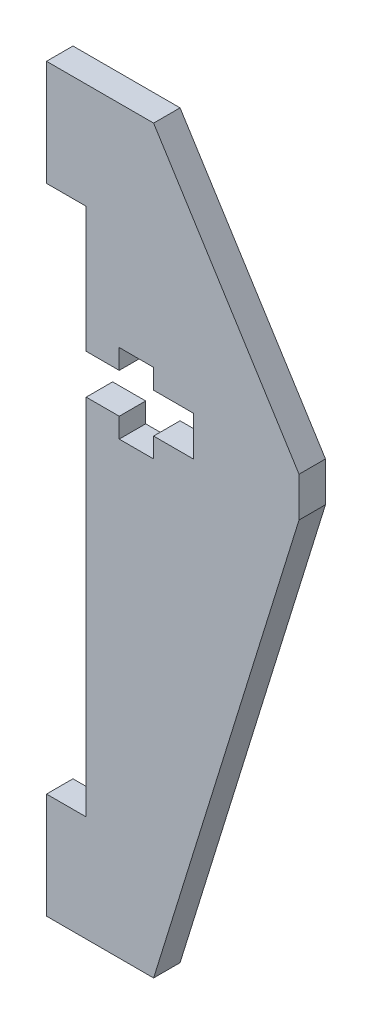
ISO-10303-21;
HEADER;
FILE_DESCRIPTION(('STEP AP214'),'2;1');
FILE_NAME('part.step','',(''),(''),'','','');
FILE_SCHEMA(('AUTOMOTIVE_DESIGN { 1 0 10303 214 1 1 1 1 }'));
ENDSEC;
DATA;
#1=APPLICATION_CONTEXT('core data for automotive mechanical design processes');
#2=APPLICATION_PROTOCOL_DEFINITION('international standard','automotive_design',2000,#1);
#3=PRODUCT_CONTEXT('',#1,'mechanical');
#4=PRODUCT('Part','Part','',(#3));
#5=PRODUCT_RELATED_PRODUCT_CATEGORY('part','',(#4));
#6=PRODUCT_DEFINITION_FORMATION('','',#4);
#7=PRODUCT_DEFINITION_CONTEXT('part definition',#1,'design');
#8=PRODUCT_DEFINITION('design','',#6,#7);
#9=PRODUCT_DEFINITION_SHAPE('','',#8);
#10=(LENGTH_UNIT() NAMED_UNIT(*) SI_UNIT(.MILLI.,.METRE.));
#11=(NAMED_UNIT(*) PLANE_ANGLE_UNIT() SI_UNIT($,.RADIAN.));
#12=(NAMED_UNIT(*) SI_UNIT($,.STERADIAN.) SOLID_ANGLE_UNIT());
#13=UNCERTAINTY_MEASURE_WITH_UNIT(LENGTH_MEASURE(1.E-05),#10,'distance_accuracy_value','');
#14=(GEOMETRIC_REPRESENTATION_CONTEXT(3) GLOBAL_UNCERTAINTY_ASSIGNED_CONTEXT((#13)) GLOBAL_UNIT_ASSIGNED_CONTEXT((#10,
#11,#12)) REPRESENTATION_CONTEXT('',''));
#15=CARTESIAN_POINT('',(0.,0.,0.));
#16=DIRECTION('',(0.,0.,1.));
#17=DIRECTION('',(1.,0.,0.));
#18=AXIS2_PLACEMENT_3D('',#15,#16,#17);
#19=CARTESIAN_POINT('',(0.,19.,2.));
#20=DIRECTION('',(0.,-1.,0.));
#21=DIRECTION('',(0.,0.,-1.));
#22=AXIS2_PLACEMENT_3D('',#19,#20,#21);
#23=PLANE('',#22);
#24=DIRECTION('',(-1.,0.,0.));
#25=VECTOR('',#24,1.);
#26=CARTESIAN_POINT('',(0.,19.,0.));
#27=LINE('',#26,#25);
#28=CARTESIAN_POINT('',(5.1000000000003,19.,0.));
#29=VERTEX_POINT('',#28);
#30=CARTESIAN_POINT('',(-3.,19.,0.));
#31=VERTEX_POINT('',#30);
#32=EDGE_CURVE('E127',#29,#31,#27,.T.);
#33=ORIENTED_EDGE('',*,*,#32,.T.);
#34=DIRECTION('',(0.,0.,-1.));
#35=VECTOR('',#34,1.);
#36=CARTESIAN_POINT('',(-3.,19.,2.));
#37=LINE('',#36,#35);
#38=CARTESIAN_POINT('',(-3.,19.,2.));
#39=VERTEX_POINT('',#38);
#40=EDGE_CURVE('E11',#39,#31,#37,.T.);
#41=ORIENTED_EDGE('',*,*,#40,.F.);
#42=DIRECTION('',(1.,0.,0.));
#43=VECTOR('',#42,1.);
#44=CARTESIAN_POINT('',(0.,19.,2.));
#45=LINE('',#44,#43);
#46=CARTESIAN_POINT('',(5.1000000000003,19.,2.));
#47=VERTEX_POINT('',#46);
#48=EDGE_CURVE('E51',#39,#47,#45,.T.);
#49=ORIENTED_EDGE('',*,*,#48,.T.);
#50=DIRECTION('',(0.,0.,-1.));
#51=VECTOR('',#50,1.);
#52=CARTESIAN_POINT('',(5.1000000000003,19.,2.));
#53=LINE('',#52,#51);
#54=EDGE_CURVE('E36',#47,#29,#53,.T.);
#55=ORIENTED_EDGE('',*,*,#54,.T.);
#56=EDGE_LOOP('',(#33,#41,#49,#55));
#57=FACE_BOUND('',#56,.T.);
#58=ADVANCED_FACE('F32',(#57),#23,.F.);
#59=CARTESIAN_POINT('',(-3.,19.,2.));
#60=DIRECTION('',(1.,0.,0.));
#61=DIRECTION('',(0.,1.,0.));
#62=AXIS2_PLACEMENT_3D('',#59,#60,#61);
#63=PLANE('',#62);
#64=DIRECTION('',(0.,-1.,0.));
#65=VECTOR('',#64,1.);
#66=CARTESIAN_POINT('',(-3.,19.,0.));
#67=LINE('',#66,#65);
#68=CARTESIAN_POINT('',(-3.,11.,0.));
#69=VERTEX_POINT('',#68);
#70=EDGE_CURVE('E121',#31,#69,#67,.T.);
#71=ORIENTED_EDGE('',*,*,#70,.T.);
#72=DIRECTION('',(0.,0.,-1.));
#73=VECTOR('',#72,1.);
#74=CARTESIAN_POINT('',(-3.,11.,2.));
#75=LINE('',#74,#73);
#76=CARTESIAN_POINT('',(-3.,11.,2.));
#77=VERTEX_POINT('',#76);
#78=EDGE_CURVE('E42',#77,#69,#75,.T.);
#79=ORIENTED_EDGE('',*,*,#78,.F.);
#80=DIRECTION('',(0.,-1.,0.));
#81=VECTOR('',#80,1.);
#82=CARTESIAN_POINT('',(-3.,19.,2.));
#83=LINE('',#82,#81);
#84=EDGE_CURVE('E196',#39,#77,#83,.T.);
#85=ORIENTED_EDGE('',*,*,#84,.F.);
#86=ORIENTED_EDGE('',*,*,#40,.T.);
#87=EDGE_LOOP('',(#71,#79,#85,#86));
#88=FACE_BOUND('',#87,.T.);
#89=ADVANCED_FACE('F439',(#88),#63,.F.);
#90=CARTESIAN_POINT('',(-3.,11.,2.));
#91=DIRECTION('',(0.,1.,0.));
#92=DIRECTION('',(0.,0.,1.));
#93=AXIS2_PLACEMENT_3D('',#90,#91,#92);
#94=PLANE('',#93);
#95=DIRECTION('',(1.,0.,0.));
#96=VECTOR('',#95,1.);
#97=CARTESIAN_POINT('',(-3.,11.,0.));
#98=LINE('',#97,#96);
#99=CARTESIAN_POINT('',(0.,11.,0.));
#100=VERTEX_POINT('',#99);
#101=EDGE_CURVE('E203',#69,#100,#98,.T.);
#102=ORIENTED_EDGE('',*,*,#101,.T.);
#103=DIRECTION('',(0.,0.,-1.));
#104=VECTOR('',#103,1.);
#105=CARTESIAN_POINT('',(0.,11.,2.));
#106=LINE('',#105,#104);
#107=CARTESIAN_POINT('',(0.,11.,2.));
#108=VERTEX_POINT('',#107);
#109=EDGE_CURVE('E200',#108,#100,#106,.T.);
#110=ORIENTED_EDGE('',*,*,#109,.F.);
#111=DIRECTION('',(1.,0.,0.));
#112=VECTOR('',#111,1.);
#113=CARTESIAN_POINT('',(-3.,11.,2.));
#114=LINE('',#113,#112);
#115=EDGE_CURVE('E189',#77,#108,#114,.T.);
#116=ORIENTED_EDGE('',*,*,#115,.F.);
#117=ORIENTED_EDGE('',*,*,#78,.T.);
#118=EDGE_LOOP('',(#102,#110,#116,#117));
#119=FACE_BOUND('',#118,.T.);
#120=ADVANCED_FACE('F201',(#119),#94,.F.);
#121=CARTESIAN_POINT('',(0.,11.,2.));
#122=DIRECTION('',(1.,0.,0.));
#123=DIRECTION('',(0.,1.,0.));
#124=AXIS2_PLACEMENT_3D('',#121,#122,#123);
#125=PLANE('',#124);
#126=DIRECTION('',(0.,-1.,0.));
#127=VECTOR('',#126,1.);
#128=CARTESIAN_POINT('',(0.,11.,0.));
#129=LINE('',#128,#127);
#130=CARTESIAN_POINT('',(0.,1.5,0.));
#131=VERTEX_POINT('',#130);
#132=EDGE_CURVE('E267',#100,#131,#129,.T.);
#133=ORIENTED_EDGE('',*,*,#132,.T.);
#134=DIRECTION('',(0.,0.,-1.));
#135=VECTOR('',#134,1.);
#136=CARTESIAN_POINT('',(0.,1.5,2.));
#137=LINE('',#136,#135);
#138=CARTESIAN_POINT('',(0.,1.5,2.));
#139=VERTEX_POINT('',#138);
#140=EDGE_CURVE('E206',#139,#131,#137,.T.);
#141=ORIENTED_EDGE('',*,*,#140,.F.);
#142=DIRECTION('',(0.,-1.,0.));
#143=VECTOR('',#142,1.);
#144=CARTESIAN_POINT('',(0.,11.,2.));
#145=LINE('',#144,#143);
#146=EDGE_CURVE('E193',#108,#139,#145,.T.);
#147=ORIENTED_EDGE('',*,*,#146,.F.);
#148=ORIENTED_EDGE('',*,*,#109,.T.);
#149=EDGE_LOOP('',(#133,#141,#147,#148));
#150=FACE_BOUND('',#149,.T.);
#151=ADVANCED_FACE('F208',(#150),#125,.F.);
#152=CARTESIAN_POINT('',(0.,1.5,2.));
#153=DIRECTION('',(0.,1.,0.));
#154=DIRECTION('',(0.,0.,1.));
#155=AXIS2_PLACEMENT_3D('',#152,#153,#154);
#156=PLANE('',#155);
#157=DIRECTION('',(1.,0.,0.));
#158=VECTOR('',#157,1.);
#159=CARTESIAN_POINT('',(0.,1.5,0.));
#160=LINE('',#159,#158);
#161=CARTESIAN_POINT('',(2.4999999999996,1.5,0.));
#162=VERTEX_POINT('',#161);
#163=EDGE_CURVE('E265',#131,#162,#160,.T.);
#164=ORIENTED_EDGE('',*,*,#163,.T.);
#165=DIRECTION('',(0.,0.,-1.));
#166=VECTOR('',#165,1.);
#167=CARTESIAN_POINT('',(2.4999999999996,1.5,2.));
#168=LINE('',#167,#166);
#169=CARTESIAN_POINT('',(2.4999999999996,1.5,2.));
#170=VERTEX_POINT('',#169);
#171=EDGE_CURVE('E274',#170,#162,#168,.T.);
#172=ORIENTED_EDGE('',*,*,#171,.F.);
#173=DIRECTION('',(1.,0.,0.));
#174=VECTOR('',#173,1.);
#175=CARTESIAN_POINT('',(0.,1.5,2.));
#176=LINE('',#175,#174);
#177=EDGE_CURVE('E211',#139,#170,#176,.T.);
#178=ORIENTED_EDGE('',*,*,#177,.F.);
#179=ORIENTED_EDGE('',*,*,#140,.T.);
#180=EDGE_LOOP('',(#164,#172,#178,#179));
#181=FACE_BOUND('',#180,.T.);
#182=ADVANCED_FACE('F318',(#181),#156,.F.);
#183=CARTESIAN_POINT('',(2.4999999999996,1.5,2.));
#184=DIRECTION('',(-1.,0.,0.));
#185=DIRECTION('',(0.,-1.,0.));
#186=AXIS2_PLACEMENT_3D('',#183,#184,#185);
#187=PLANE('',#186);
#188=DIRECTION('',(0.,1.,0.));
#189=VECTOR('',#188,1.);
#190=CARTESIAN_POINT('',(2.4999999999996,1.5,0.));
#191=LINE('',#190,#189);
#192=CARTESIAN_POINT('',(2.49999999999959,2.99999999999989,0.));
#193=VERTEX_POINT('',#192);
#194=EDGE_CURVE('E263',#162,#193,#191,.T.);
#195=ORIENTED_EDGE('',*,*,#194,.T.);
#196=DIRECTION('',(0.,0.,-1.));
#197=VECTOR('',#196,1.);
#198=CARTESIAN_POINT('',(2.49999999999959,2.99999999999989,2.));
#199=LINE('',#198,#197);
#200=CARTESIAN_POINT('',(2.49999999999959,2.99999999999989,2.));
#201=VERTEX_POINT('',#200);
#202=EDGE_CURVE('E277',#201,#193,#199,.T.);
#203=ORIENTED_EDGE('',*,*,#202,.F.);
#204=DIRECTION('',(0.,1.,0.));
#205=VECTOR('',#204,1.);
#206=CARTESIAN_POINT('',(2.4999999999996,1.5,2.));
#207=LINE('',#206,#205);
#208=EDGE_CURVE('E213',#170,#201,#207,.T.);
#209=ORIENTED_EDGE('',*,*,#208,.F.);
#210=ORIENTED_EDGE('',*,*,#171,.T.);
#211=EDGE_LOOP('',(#195,#203,#209,#210));
#212=FACE_BOUND('',#211,.T.);
#213=ADVANCED_FACE('F326',(#212),#187,.F.);
#214=CARTESIAN_POINT('',(2.49999999999959,2.99999999999989,2.));
#215=DIRECTION('',(0.,1.,0.));
#216=DIRECTION('',(-1.,0.,0.));
#217=AXIS2_PLACEMENT_3D('',#214,#215,#216);
#218=PLANE('',#217);
#219=DIRECTION('',(1.,0.,0.));
#220=VECTOR('',#219,1.);
#221=CARTESIAN_POINT('',(2.49999999999959,2.99999999999989,0.));
#222=LINE('',#221,#220);
#223=CARTESIAN_POINT('',(5.1000000000003,2.99999999999992,0.));
#224=VERTEX_POINT('',#223);
#225=EDGE_CURVE('E261',#193,#224,#222,.T.);
#226=ORIENTED_EDGE('',*,*,#225,.T.);
#227=DIRECTION('',(0.,0.,-1.));
#228=VECTOR('',#227,1.);
#229=CARTESIAN_POINT('',(5.1000000000003,2.99999999999992,2.));
#230=LINE('',#229,#228);
#231=CARTESIAN_POINT('',(5.1000000000003,2.99999999999992,2.));
#232=VERTEX_POINT('',#231);
#233=EDGE_CURVE('E280',#232,#224,#230,.T.);
#234=ORIENTED_EDGE('',*,*,#233,.F.);
#235=DIRECTION('',(1.,0.,0.));
#236=VECTOR('',#235,1.);
#237=CARTESIAN_POINT('',(2.49999999999959,2.99999999999989,2.));
#238=LINE('',#237,#236);
#239=EDGE_CURVE('E323',#201,#232,#238,.T.);
#240=ORIENTED_EDGE('',*,*,#239,.F.);
#241=ORIENTED_EDGE('',*,*,#202,.T.);
#242=EDGE_LOOP('',(#226,#234,#240,#241));
#243=FACE_BOUND('',#242,.T.);
#244=ADVANCED_FACE('F329',(#243),#218,.F.);
#245=CARTESIAN_POINT('',(5.1000000000003,2.99999999999992,2.));
#246=DIRECTION('',(1.,0.,0.));
#247=DIRECTION('',(0.,1.,0.));
#248=AXIS2_PLACEMENT_3D('',#245,#246,#247);
#249=PLANE('',#248);
#250=DIRECTION('',(0.,-1.,0.));
#251=VECTOR('',#250,1.);
#252=CARTESIAN_POINT('',(5.1000000000003,2.99999999999992,0.));
#253=LINE('',#252,#251);
#254=CARTESIAN_POINT('',(5.10000000000031,1.49999999998571,0.));
#255=VERTEX_POINT('',#254);
#256=EDGE_CURVE('E259',#224,#255,#253,.T.);
#257=ORIENTED_EDGE('',*,*,#256,.T.);
#258=DIRECTION('',(0.,0.,-1.));
#259=VECTOR('',#258,1.);
#260=CARTESIAN_POINT('',(5.10000000000031,1.49999999998571,2.));
#261=LINE('',#260,#259);
#262=CARTESIAN_POINT('',(5.10000000000031,1.49999999998571,2.));
#263=VERTEX_POINT('',#262);
#264=EDGE_CURVE('E283',#263,#255,#261,.T.);
#265=ORIENTED_EDGE('',*,*,#264,.F.);
#266=DIRECTION('',(0.,-1.,0.));
#267=VECTOR('',#266,1.);
#268=CARTESIAN_POINT('',(5.1000000000003,2.99999999999992,2.));
#269=LINE('',#268,#267);
#270=EDGE_CURVE('E331',#232,#263,#269,.T.);
#271=ORIENTED_EDGE('',*,*,#270,.F.);
#272=ORIENTED_EDGE('',*,*,#233,.T.);
#273=EDGE_LOOP('',(#257,#265,#271,#272));
#274=FACE_BOUND('',#273,.T.);
#275=ADVANCED_FACE('F429',(#274),#249,.F.);
#276=CARTESIAN_POINT('',(5.10000000000031,1.49999999998571,2.));
#277=DIRECTION('',(0.,1.,0.));
#278=DIRECTION('',(-1.,0.,0.));
#279=AXIS2_PLACEMENT_3D('',#276,#277,#278);
#280=PLANE('',#279);
#281=DIRECTION('',(1.,0.,0.));
#282=VECTOR('',#281,1.);
#283=CARTESIAN_POINT('',(5.10000000000031,1.49999999998571,0.));
#284=LINE('',#283,#282);
#285=CARTESIAN_POINT('',(8.09999999999987,1.49999999998573,0.));
#286=VERTEX_POINT('',#285);
#287=EDGE_CURVE('E257',#255,#286,#284,.T.);
#288=ORIENTED_EDGE('',*,*,#287,.T.);
#289=DIRECTION('',(0.,0.,-1.));
#290=VECTOR('',#289,1.);
#291=CARTESIAN_POINT('',(8.09999999999987,1.49999999998573,2.));
#292=LINE('',#291,#290);
#293=CARTESIAN_POINT('',(8.09999999999987,1.49999999998573,2.));
#294=VERTEX_POINT('',#293);
#295=EDGE_CURVE('E286',#294,#286,#292,.T.);
#296=ORIENTED_EDGE('',*,*,#295,.F.);
#297=DIRECTION('',(1.,0.,0.));
#298=VECTOR('',#297,1.);
#299=CARTESIAN_POINT('',(5.10000000000031,1.49999999998571,2.));
#300=LINE('',#299,#298);
#301=EDGE_CURVE('E333',#263,#294,#300,.T.);
#302=ORIENTED_EDGE('',*,*,#301,.F.);
#303=ORIENTED_EDGE('',*,*,#264,.T.);
#304=EDGE_LOOP('',(#288,#296,#302,#303));
#305=FACE_BOUND('',#304,.T.);
#306=ADVANCED_FACE('F426',(#305),#280,.F.);
#307=CARTESIAN_POINT('',(8.09999999999987,1.49999999998573,2.));
#308=DIRECTION('',(1.,0.,0.));
#309=DIRECTION('',(0.,1.,0.));
#310=AXIS2_PLACEMENT_3D('',#307,#308,#309);
#311=PLANE('',#310);
#312=DIRECTION('',(0.,-1.,0.));
#313=VECTOR('',#312,1.);
#314=CARTESIAN_POINT('',(8.09999999999987,1.49999999998573,0.));
#315=LINE('',#314,#313);
#316=CARTESIAN_POINT('',(8.09999999999988,-1.49999999998585,0.));
#317=VERTEX_POINT('',#316);
#318=EDGE_CURVE('E254',#286,#317,#315,.T.);
#319=ORIENTED_EDGE('',*,*,#318,.T.);
#320=DIRECTION('',(0.,0.,-1.));
#321=VECTOR('',#320,1.);
#322=CARTESIAN_POINT('',(8.09999999999988,-1.49999999998585,2.));
#323=LINE('',#322,#321);
#324=CARTESIAN_POINT('',(8.09999999999988,-1.49999999998585,2.));
#325=VERTEX_POINT('',#324);
#326=EDGE_CURVE('E289',#325,#317,#323,.T.);
#327=ORIENTED_EDGE('',*,*,#326,.F.);
#328=DIRECTION('',(0.,-1.,0.));
#329=VECTOR('',#328,1.);
#330=CARTESIAN_POINT('',(8.09999999999987,1.49999999998573,2.));
#331=LINE('',#330,#329);
#332=EDGE_CURVE('E337',#294,#325,#331,.T.);
#333=ORIENTED_EDGE('',*,*,#332,.F.);
#334=ORIENTED_EDGE('',*,*,#295,.T.);
#335=EDGE_LOOP('',(#319,#327,#333,#334));
#336=FACE_BOUND('',#335,.T.);
#337=ADVANCED_FACE('F421',(#336),#311,.F.);
#338=CARTESIAN_POINT('',(5.09999999999944,-1.49999999998587,2.));
#339=DIRECTION('',(0.,1.,0.));
#340=DIRECTION('',(-1.,0.,0.));
#341=AXIS2_PLACEMENT_3D('',#338,#339,#340);
#342=PLANE('',#341);
#343=DIRECTION('',(1.,0.,0.));
#344=VECTOR('',#343,1.);
#345=CARTESIAN_POINT('',(5.09999999999944,-1.49999999998587,0.));
#346=LINE('',#345,#344);
#347=CARTESIAN_POINT('',(5.09999999999944,-1.49999999998587,0.));
#348=VERTEX_POINT('',#347);
#349=EDGE_CURVE('E251',#348,#317,#346,.T.);
#350=ORIENTED_EDGE('',*,*,#349,.F.);
#351=DIRECTION('',(0.,0.,-1.));
#352=VECTOR('',#351,1.);
#353=CARTESIAN_POINT('',(5.09999999999944,-1.49999999998587,2.));
#354=LINE('',#353,#352);
#355=CARTESIAN_POINT('',(5.09999999999944,-1.49999999998587,2.));
#356=VERTEX_POINT('',#355);
#357=EDGE_CURVE('E291',#356,#348,#354,.T.);
#358=ORIENTED_EDGE('',*,*,#357,.F.);
#359=DIRECTION('',(1.,0.,0.));
#360=VECTOR('',#359,1.);
#361=CARTESIAN_POINT('',(5.09999999999944,-1.49999999998587,2.));
#362=LINE('',#361,#360);
#363=EDGE_CURVE('E339',#356,#325,#362,.T.);
#364=ORIENTED_EDGE('',*,*,#363,.T.);
#365=ORIENTED_EDGE('',*,*,#326,.T.);
#366=EDGE_LOOP('',(#350,#358,#364,#365));
#367=FACE_BOUND('',#366,.T.);
#368=ADVANCED_FACE('F415',(#367),#342,.T.);
#369=CARTESIAN_POINT('',(5.09999999999944,-2.99999999999963,2.));
#370=DIRECTION('',(-1.,0.,0.));
#371=DIRECTION('',(0.,0.,1.));
#372=AXIS2_PLACEMENT_3D('',#369,#370,#371);
#373=PLANE('',#372);
#374=DIRECTION('',(0.,1.,0.));
#375=VECTOR('',#374,1.);
#376=CARTESIAN_POINT('',(5.09999999999944,-2.99999999999963,0.));
#377=LINE('',#376,#375);
#378=CARTESIAN_POINT('',(5.09999999999944,-2.99999999999963,0.));
#379=VERTEX_POINT('',#378);
#380=EDGE_CURVE('E248',#379,#348,#377,.T.);
#381=ORIENTED_EDGE('',*,*,#380,.F.);
#382=DIRECTION('',(0.,0.,-1.));
#383=VECTOR('',#382,1.);
#384=CARTESIAN_POINT('',(5.09999999999944,-2.99999999999963,2.));
#385=LINE('',#384,#383);
#386=CARTESIAN_POINT('',(5.09999999999944,-2.99999999999963,2.));
#387=VERTEX_POINT('',#386);
#388=EDGE_CURVE('E293',#387,#379,#385,.T.);
#389=ORIENTED_EDGE('',*,*,#388,.F.);
#390=DIRECTION('',(0.,1.,0.));
#391=VECTOR('',#390,1.);
#392=CARTESIAN_POINT('',(5.09999999999944,-2.99999999999963,2.));
#393=LINE('',#392,#391);
#394=EDGE_CURVE('E342',#387,#356,#393,.T.);
#395=ORIENTED_EDGE('',*,*,#394,.T.);
#396=ORIENTED_EDGE('',*,*,#357,.T.);
#397=EDGE_LOOP('',(#381,#389,#395,#396));
#398=FACE_BOUND('',#397,.T.);
#399=ADVANCED_FACE('F411',(#398),#373,.T.);
#400=CARTESIAN_POINT('',(2.49999999999961,-2.99999999999967,2.));
#401=DIRECTION('',(0.,1.,0.));
#402=DIRECTION('',(-1.,0.,0.));
#403=AXIS2_PLACEMENT_3D('',#400,#401,#402);
#404=PLANE('',#403);
#405=DIRECTION('',(1.,0.,0.));
#406=VECTOR('',#405,1.);
#407=CARTESIAN_POINT('',(2.49999999999961,-2.99999999999967,0.));
#408=LINE('',#407,#406);
#409=CARTESIAN_POINT('',(2.49999999999961,-2.99999999999967,0.));
#410=VERTEX_POINT('',#409);
#411=EDGE_CURVE('E245',#410,#379,#408,.T.);
#412=ORIENTED_EDGE('',*,*,#411,.F.);
#413=DIRECTION('',(0.,0.,-1.));
#414=VECTOR('',#413,1.);
#415=CARTESIAN_POINT('',(2.49999999999961,-2.99999999999967,2.));
#416=LINE('',#415,#414);
#417=CARTESIAN_POINT('',(2.49999999999961,-2.99999999999967,2.));
#418=VERTEX_POINT('',#417);
#419=EDGE_CURVE('E295',#418,#410,#416,.T.);
#420=ORIENTED_EDGE('',*,*,#419,.F.);
#421=DIRECTION('',(1.,0.,0.));
#422=VECTOR('',#421,1.);
#423=CARTESIAN_POINT('',(2.49999999999961,-2.99999999999967,2.));
#424=LINE('',#423,#422);
#425=EDGE_CURVE('E345',#418,#387,#424,.T.);
#426=ORIENTED_EDGE('',*,*,#425,.T.);
#427=ORIENTED_EDGE('',*,*,#388,.T.);
#428=EDGE_LOOP('',(#412,#420,#426,#427));
#429=FACE_BOUND('',#428,.T.);
#430=ADVANCED_FACE('F407',(#429),#404,.T.);
#431=CARTESIAN_POINT('',(2.49999999999961,-1.5,2.));
#432=DIRECTION('',(1.,0.,0.));
#433=DIRECTION('',(0.,0.,-1.));
#434=AXIS2_PLACEMENT_3D('',#431,#432,#433);
#435=PLANE('',#434);
#436=DIRECTION('',(0.,-1.,0.));
#437=VECTOR('',#436,1.);
#438=CARTESIAN_POINT('',(2.49999999999961,-1.5,0.));
#439=LINE('',#438,#437);
#440=CARTESIAN_POINT('',(2.49999999999961,-1.5,0.));
#441=VERTEX_POINT('',#440);
#442=EDGE_CURVE('E242',#441,#410,#439,.T.);
#443=ORIENTED_EDGE('',*,*,#442,.F.);
#444=DIRECTION('',(0.,0.,-1.));
#445=VECTOR('',#444,1.);
#446=CARTESIAN_POINT('',(2.49999999999961,-1.5,2.));
#447=LINE('',#446,#445);
#448=CARTESIAN_POINT('',(2.49999999999961,-1.5,2.));
#449=VERTEX_POINT('',#448);
#450=EDGE_CURVE('E297',#449,#441,#447,.T.);
#451=ORIENTED_EDGE('',*,*,#450,.F.);
#452=DIRECTION('',(0.,-1.,0.));
#453=VECTOR('',#452,1.);
#454=CARTESIAN_POINT('',(2.49999999999961,-1.5,2.));
#455=LINE('',#454,#453);
#456=EDGE_CURVE('E348',#449,#418,#455,.T.);
#457=ORIENTED_EDGE('',*,*,#456,.T.);
#458=ORIENTED_EDGE('',*,*,#419,.T.);
#459=EDGE_LOOP('',(#443,#451,#457,#458));
#460=FACE_BOUND('',#459,.T.);
#461=ADVANCED_FACE('F403',(#460),#435,.T.);
#462=CARTESIAN_POINT('',(2.49999999999961,-1.5,2.));
#463=DIRECTION('',(0.,-1.,0.));
#464=DIRECTION('',(0.,0.,-1.));
#465=AXIS2_PLACEMENT_3D('',#462,#463,#464);
#466=PLANE('',#465);
#467=DIRECTION('',(-1.,0.,0.));
#468=VECTOR('',#467,1.);
#469=CARTESIAN_POINT('',(2.49999999999961,-1.5,0.));
#470=LINE('',#469,#468);
#471=CARTESIAN_POINT('',(0.,-1.5,0.));
#472=VERTEX_POINT('',#471);
#473=EDGE_CURVE('E239',#441,#472,#470,.T.);
#474=ORIENTED_EDGE('',*,*,#473,.T.);
#475=DIRECTION('',(0.,0.,-1.));
#476=VECTOR('',#475,1.);
#477=CARTESIAN_POINT('',(0.,-1.5,2.));
#478=LINE('',#477,#476);
#479=CARTESIAN_POINT('',(0.,-1.5,2.));
#480=VERTEX_POINT('',#479);
#481=EDGE_CURVE('E299',#480,#472,#478,.T.);
#482=ORIENTED_EDGE('',*,*,#481,.F.);
#483=DIRECTION('',(-1.,0.,0.));
#484=VECTOR('',#483,1.);
#485=CARTESIAN_POINT('',(2.49999999999961,-1.5,2.));
#486=LINE('',#485,#484);
#487=EDGE_CURVE('E351',#449,#480,#486,.T.);
#488=ORIENTED_EDGE('',*,*,#487,.F.);
#489=ORIENTED_EDGE('',*,*,#450,.T.);
#490=EDGE_LOOP('',(#474,#482,#488,#489));
#491=FACE_BOUND('',#490,.T.);
#492=ADVANCED_FACE('F400',(#491),#466,.F.);
#493=CARTESIAN_POINT('',(0.,-29.,2.));
#494=DIRECTION('',(-1.,0.,0.));
#495=DIRECTION('',(0.,-1.,0.));
#496=AXIS2_PLACEMENT_3D('',#493,#494,#495);
#497=PLANE('',#496);
#498=DIRECTION('',(0.,1.,0.));
#499=VECTOR('',#498,1.);
#500=CARTESIAN_POINT('',(0.,-29.,0.));
#501=LINE('',#500,#499);
#502=CARTESIAN_POINT('',(0.,-29.,0.));
#503=VERTEX_POINT('',#502);
#504=EDGE_CURVE('E236',#503,#472,#501,.T.);
#505=ORIENTED_EDGE('',*,*,#504,.F.);
#506=DIRECTION('',(0.,0.,-1.));
#507=VECTOR('',#506,1.);
#508=CARTESIAN_POINT('',(0.,-29.,2.));
#509=LINE('',#508,#507);
#510=CARTESIAN_POINT('',(0.,-29.,2.));
#511=VERTEX_POINT('',#510);
#512=EDGE_CURVE('E301',#511,#503,#509,.T.);
#513=ORIENTED_EDGE('',*,*,#512,.F.);
#514=DIRECTION('',(0.,1.,0.));
#515=VECTOR('',#514,1.);
#516=CARTESIAN_POINT('',(0.,-29.,2.));
#517=LINE('',#516,#515);
#518=EDGE_CURVE('E353',#511,#480,#517,.T.);
#519=ORIENTED_EDGE('',*,*,#518,.T.);
#520=ORIENTED_EDGE('',*,*,#481,.T.);
#521=EDGE_LOOP('',(#505,#513,#519,#520));
#522=FACE_BOUND('',#521,.T.);
#523=ADVANCED_FACE('F395',(#522),#497,.T.);
#524=CARTESIAN_POINT('',(-3.,-29.,2.));
#525=DIRECTION('',(0.,1.,0.));
#526=DIRECTION('',(0.,0.,1.));
#527=AXIS2_PLACEMENT_3D('',#524,#525,#526);
#528=PLANE('',#527);
#529=DIRECTION('',(1.,0.,0.));
#530=VECTOR('',#529,1.);
#531=CARTESIAN_POINT('',(-3.,-29.,0.));
#532=LINE('',#531,#530);
#533=CARTESIAN_POINT('',(-3.,-29.,0.));
#534=VERTEX_POINT('',#533);
#535=EDGE_CURVE('E233',#534,#503,#532,.T.);
#536=ORIENTED_EDGE('',*,*,#535,.F.);
#537=DIRECTION('',(0.,0.,-1.));
#538=VECTOR('',#537,1.);
#539=CARTESIAN_POINT('',(-3.,-29.,2.));
#540=LINE('',#539,#538);
#541=CARTESIAN_POINT('',(-3.,-29.,2.));
#542=VERTEX_POINT('',#541);
#543=EDGE_CURVE('E303',#542,#534,#540,.T.);
#544=ORIENTED_EDGE('',*,*,#543,.F.);
#545=DIRECTION('',(1.,0.,0.));
#546=VECTOR('',#545,1.);
#547=CARTESIAN_POINT('',(-3.,-29.,2.));
#548=LINE('',#547,#546);
#549=EDGE_CURVE('E356',#542,#511,#548,.T.);
#550=ORIENTED_EDGE('',*,*,#549,.T.);
#551=ORIENTED_EDGE('',*,*,#512,.T.);
#552=EDGE_LOOP('',(#536,#544,#550,#551));
#553=FACE_BOUND('',#552,.T.);
#554=ADVANCED_FACE('F390',(#553),#528,.T.);
#555=CARTESIAN_POINT('',(-3.,-37.,2.));
#556=DIRECTION('',(-1.,0.,0.));
#557=DIRECTION('',(0.,0.,1.));
#558=AXIS2_PLACEMENT_3D('',#555,#556,#557);
#559=PLANE('',#558);
#560=DIRECTION('',(0.,1.,0.));
#561=VECTOR('',#560,1.);
#562=CARTESIAN_POINT('',(-3.,-37.,0.));
#563=LINE('',#562,#561);
#564=CARTESIAN_POINT('',(-3.,-37.,0.));
#565=VERTEX_POINT('',#564);
#566=EDGE_CURVE('E230',#565,#534,#563,.T.);
#567=ORIENTED_EDGE('',*,*,#566,.F.);
#568=DIRECTION('',(0.,0.,-1.));
#569=VECTOR('',#568,1.);
#570=CARTESIAN_POINT('',(-3.,-37.,2.));
#571=LINE('',#570,#569);
#572=CARTESIAN_POINT('',(-3.,-37.,2.));
#573=VERTEX_POINT('',#572);
#574=EDGE_CURVE('E305',#573,#565,#571,.T.);
#575=ORIENTED_EDGE('',*,*,#574,.F.);
#576=DIRECTION('',(0.,1.,0.));
#577=VECTOR('',#576,1.);
#578=CARTESIAN_POINT('',(-3.,-37.,2.));
#579=LINE('',#578,#577);
#580=EDGE_CURVE('E359',#573,#542,#579,.T.);
#581=ORIENTED_EDGE('',*,*,#580,.T.);
#582=ORIENTED_EDGE('',*,*,#543,.T.);
#583=EDGE_LOOP('',(#567,#575,#581,#582));
#584=FACE_BOUND('',#583,.T.);
#585=ADVANCED_FACE('F386',(#584),#559,.T.);
#586=CARTESIAN_POINT('',(0.,-37.,2.));
#587=DIRECTION('',(0.,-1.,0.));
#588=DIRECTION('',(0.,0.,-1.));
#589=AXIS2_PLACEMENT_3D('',#586,#587,#588);
#590=PLANE('',#589);
#591=DIRECTION('',(-1.,0.,0.));
#592=VECTOR('',#591,1.);
#593=CARTESIAN_POINT('',(0.,-37.,0.));
#594=LINE('',#593,#592);
#595=CARTESIAN_POINT('',(5.09999999999944,-37.,0.));
#596=VERTEX_POINT('',#595);
#597=EDGE_CURVE('E227',#596,#565,#594,.T.);
#598=ORIENTED_EDGE('',*,*,#597,.F.);
#599=DIRECTION('',(0.,0.,-1.));
#600=VECTOR('',#599,1.);
#601=CARTESIAN_POINT('',(5.09999999999944,-37.,2.));
#602=LINE('',#601,#600);
#603=CARTESIAN_POINT('',(5.09999999999944,-37.,2.));
#604=VERTEX_POINT('',#603);
#605=EDGE_CURVE('E307',#604,#596,#602,.T.);
#606=ORIENTED_EDGE('',*,*,#605,.F.);
#607=DIRECTION('',(-1.,0.,0.));
#608=VECTOR('',#607,1.);
#609=CARTESIAN_POINT('',(5.09999999999944,-37.,2.));
#610=LINE('',#609,#608);
#611=EDGE_CURVE('E362',#604,#573,#610,.T.);
#612=ORIENTED_EDGE('',*,*,#611,.T.);
#613=ORIENTED_EDGE('',*,*,#574,.T.);
#614=EDGE_LOOP('',(#598,#606,#612,#613));
#615=FACE_BOUND('',#614,.T.);
#616=ADVANCED_FACE('F382',(#615),#590,.T.);
#617=CARTESIAN_POINT('',(16.0999999999999,-1.49999999998585,2.));
#618=DIRECTION('',(0.955195367474794,-0.295976029358281,0.));
#619=DIRECTION('',(0.295976029358281,0.955195367474794,0.));
#620=AXIS2_PLACEMENT_3D('',#617,#618,#619);
#621=PLANE('',#620);
#622=DIRECTION('',(-0.295976029358281,-0.955195367474794,0.));
#623=VECTOR('',#622,1.);
#624=CARTESIAN_POINT('',(16.0999999999999,-1.49999999998585,0.));
#625=LINE('',#624,#623);
#626=CARTESIAN_POINT('',(16.0999999999999,-1.49999999998585,0.));
#627=VERTEX_POINT('',#626);
#628=EDGE_CURVE('E224',#627,#596,#625,.T.);
#629=ORIENTED_EDGE('',*,*,#628,.F.);
#630=DIRECTION('',(0.,0.,-1.));
#631=VECTOR('',#630,1.);
#632=CARTESIAN_POINT('',(16.0999999999999,-1.49999999998585,2.));
#633=LINE('',#632,#631);
#634=CARTESIAN_POINT('',(16.0999999999999,-1.49999999998585,2.));
#635=VERTEX_POINT('',#634);
#636=EDGE_CURVE('E310',#635,#627,#633,.T.);
#637=ORIENTED_EDGE('',*,*,#636,.F.);
#638=DIRECTION('',(-0.295976029358281,-0.955195367474794,0.));
#639=VECTOR('',#638,1.);
#640=CARTESIAN_POINT('',(16.0999999999999,-1.49999999998585,2.));
#641=LINE('',#640,#639);
#642=EDGE_CURVE('E364',#635,#604,#641,.T.);
#643=ORIENTED_EDGE('',*,*,#642,.T.);
#644=ORIENTED_EDGE('',*,*,#605,.T.);
#645=EDGE_LOOP('',(#629,#637,#643,#644));
#646=FACE_BOUND('',#645,.T.);
#647=ADVANCED_FACE('F379',(#646),#621,.T.);
#648=CARTESIAN_POINT('',(16.0999999999999,1.49999999998571,2.));
#649=DIRECTION('',(1.,0.,0.));
#650=DIRECTION('',(0.,0.,-1.));
#651=AXIS2_PLACEMENT_3D('',#648,#649,#650);
#652=PLANE('',#651);
#653=DIRECTION('',(0.,-1.,0.));
#654=VECTOR('',#653,1.);
#655=CARTESIAN_POINT('',(16.0999999999999,1.49999999998571,0.));
#656=LINE('',#655,#654);
#657=CARTESIAN_POINT('',(16.0999999999999,1.49999999998571,0.));
#658=VERTEX_POINT('',#657);
#659=EDGE_CURVE('E221',#658,#627,#656,.T.);
#660=ORIENTED_EDGE('',*,*,#659,.F.);
#661=DIRECTION('',(0.,0.,-1.));
#662=VECTOR('',#661,1.);
#663=CARTESIAN_POINT('',(16.0999999999999,1.49999999998571,2.));
#664=LINE('',#663,#662);
#665=CARTESIAN_POINT('',(16.0999999999999,1.49999999998571,2.));
#666=VERTEX_POINT('',#665);
#667=EDGE_CURVE('E311',#666,#658,#664,.T.);
#668=ORIENTED_EDGE('',*,*,#667,.F.);
#669=DIRECTION('',(0.,-1.,0.));
#670=VECTOR('',#669,1.);
#671=CARTESIAN_POINT('',(16.0999999999999,1.49999999998571,2.));
#672=LINE('',#671,#670);
#673=EDGE_CURVE('E367',#666,#635,#672,.T.);
#674=ORIENTED_EDGE('',*,*,#673,.T.);
#675=ORIENTED_EDGE('',*,*,#636,.T.);
#676=EDGE_LOOP('',(#660,#668,#674,#675));
#677=FACE_BOUND('',#676,.T.);
#678=ADVANCED_FACE('F376',(#677),#652,.T.);
#679=CARTESIAN_POINT('',(5.1000000000003,19.,2.));
#680=DIRECTION('',(0.84663654921121,0.53217154521802,0.));
#681=DIRECTION('',(-0.53217154521802,0.84663654921121,0.));
#682=AXIS2_PLACEMENT_3D('',#679,#680,#681);
#683=PLANE('',#682);
#684=DIRECTION('',(0.53217154521802,-0.84663654921121,0.));
#685=VECTOR('',#684,1.);
#686=CARTESIAN_POINT('',(5.1000000000003,19.,0.));
#687=LINE('',#686,#685);
#688=EDGE_CURVE('E218',#29,#658,#687,.T.);
#689=ORIENTED_EDGE('',*,*,#688,.F.);
#690=ORIENTED_EDGE('',*,*,#54,.F.);
#691=DIRECTION('',(0.53217154521802,-0.84663654921121,0.));
#692=VECTOR('',#691,1.);
#693=CARTESIAN_POINT('',(5.1000000000003,19.,2.));
#694=LINE('',#693,#692);
#695=EDGE_CURVE('E370',#47,#666,#694,.T.);
#696=ORIENTED_EDGE('',*,*,#695,.T.);
#697=ORIENTED_EDGE('',*,*,#667,.T.);
#698=EDGE_LOOP('',(#689,#690,#696,#697));
#699=FACE_BOUND('',#698,.T.);
#700=ADVANCED_FACE('F34',(#699),#683,.T.);
#701=CARTESIAN_POINT('',(0.,0.,2.));
#702=DIRECTION('',(0.,0.,-1.));
#703=DIRECTION('',(-1.,0.,0.));
#704=AXIS2_PLACEMENT_3D('',#701,#702,#703);
#705=PLANE('',#704);
#706=ORIENTED_EDGE('',*,*,#48,.F.);
#707=ORIENTED_EDGE('',*,*,#84,.T.);
#708=ORIENTED_EDGE('',*,*,#115,.T.);
#709=ORIENTED_EDGE('',*,*,#146,.T.);
#710=ORIENTED_EDGE('',*,*,#177,.T.);
#711=ORIENTED_EDGE('',*,*,#208,.T.);
#712=ORIENTED_EDGE('',*,*,#239,.T.);
#713=ORIENTED_EDGE('',*,*,#270,.T.);
#714=ORIENTED_EDGE('',*,*,#301,.T.);
#715=ORIENTED_EDGE('',*,*,#332,.T.);
#716=ORIENTED_EDGE('',*,*,#363,.F.);
#717=ORIENTED_EDGE('',*,*,#394,.F.);
#718=ORIENTED_EDGE('',*,*,#425,.F.);
#719=ORIENTED_EDGE('',*,*,#456,.F.);
#720=ORIENTED_EDGE('',*,*,#487,.T.);
#721=ORIENTED_EDGE('',*,*,#518,.F.);
#722=ORIENTED_EDGE('',*,*,#549,.F.);
#723=ORIENTED_EDGE('',*,*,#580,.F.);
#724=ORIENTED_EDGE('',*,*,#611,.F.);
#725=ORIENTED_EDGE('',*,*,#642,.F.);
#726=ORIENTED_EDGE('',*,*,#673,.F.);
#727=ORIENTED_EDGE('',*,*,#695,.F.);
#728=EDGE_LOOP('',(#706,#707,#708,#709,#710,#711,#712,#713,#714,#715,#716,#717,#718,#719,#720,
#721,#722,#723,#724,#725,#726,#727));
#729=FACE_BOUND('',#728,.T.);
#730=ADVANCED_FACE('F191',(#729),#705,.F.);
#731=CARTESIAN_POINT('',(0.,0.,0.));
#732=DIRECTION('',(0.,0.,-1.));
#733=DIRECTION('',(-1.,0.,0.));
#734=AXIS2_PLACEMENT_3D('',#731,#732,#733);
#735=PLANE('',#734);
#736=ORIENTED_EDGE('',*,*,#32,.F.);
#737=ORIENTED_EDGE('',*,*,#688,.T.);
#738=ORIENTED_EDGE('',*,*,#659,.T.);
#739=ORIENTED_EDGE('',*,*,#628,.T.);
#740=ORIENTED_EDGE('',*,*,#597,.T.);
#741=ORIENTED_EDGE('',*,*,#566,.T.);
#742=ORIENTED_EDGE('',*,*,#535,.T.);
#743=ORIENTED_EDGE('',*,*,#504,.T.);
#744=ORIENTED_EDGE('',*,*,#473,.F.);
#745=ORIENTED_EDGE('',*,*,#442,.T.);
#746=ORIENTED_EDGE('',*,*,#411,.T.);
#747=ORIENTED_EDGE('',*,*,#380,.T.);
#748=ORIENTED_EDGE('',*,*,#349,.T.);
#749=ORIENTED_EDGE('',*,*,#318,.F.);
#750=ORIENTED_EDGE('',*,*,#287,.F.);
#751=ORIENTED_EDGE('',*,*,#256,.F.);
#752=ORIENTED_EDGE('',*,*,#225,.F.);
#753=ORIENTED_EDGE('',*,*,#194,.F.);
#754=ORIENTED_EDGE('',*,*,#163,.F.);
#755=ORIENTED_EDGE('',*,*,#132,.F.);
#756=ORIENTED_EDGE('',*,*,#101,.F.);
#757=ORIENTED_EDGE('',*,*,#70,.F.);
#758=EDGE_LOOP('',(#736,#737,#738,#739,#740,#741,#742,#743,#744,#745,#746,#747,#748,#749,#750,
#751,#752,#753,#754,#755,#756,#757));
#759=FACE_BOUND('',#758,.T.);
#760=ADVANCED_FACE('F314',(#759),#735,.T.);
#761=CLOSED_SHELL('',(#58,#89,#120,#151,#182,#213,#244,#275,#306,#337,#368,#399,#430,#461,#492,
#523,#554,#585,#616,#647,#678,#700,#730,#760));
#762=MANIFOLD_SOLID_BREP('B2',#761);
#763=ADVANCED_BREP_SHAPE_REPRESENTATION('',(#18,#762),#14);
#764=SHAPE_DEFINITION_REPRESENTATION(#9,#763);
ENDSEC;
END-ISO-10303-21;
